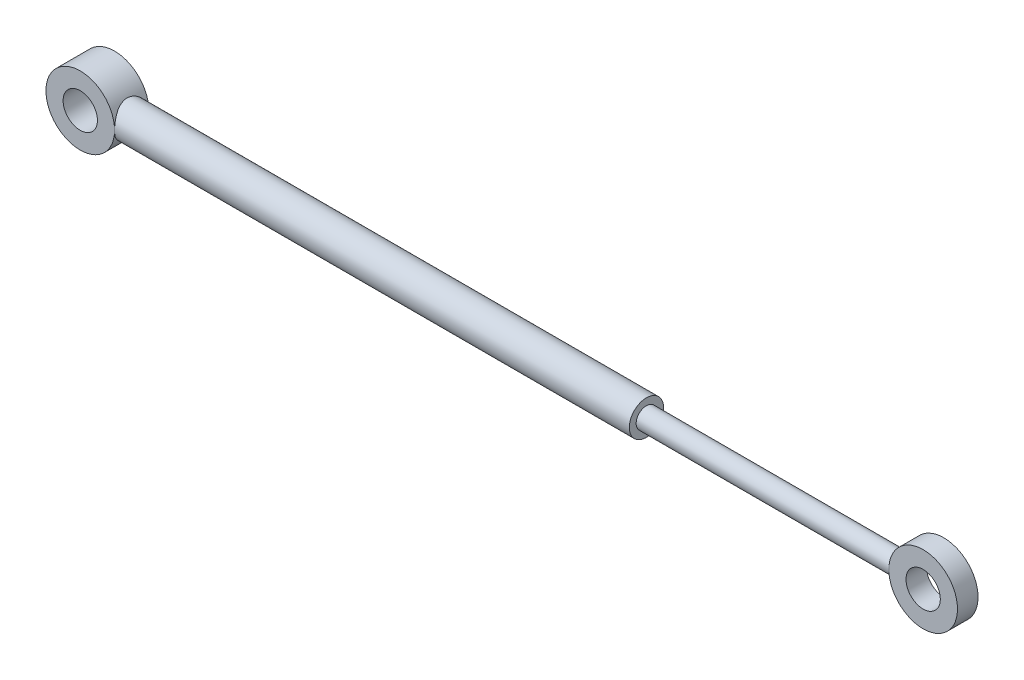
ISO-10303-21;
HEADER;
FILE_DESCRIPTION(('STEP AP214'),'2;1');
FILE_NAME('part.step','',(''),(''),'','','');
FILE_SCHEMA(('AUTOMOTIVE_DESIGN { 1 0 10303 214 1 1 1 1 }'));
ENDSEC;
DATA;
#1=APPLICATION_CONTEXT('core data for automotive mechanical design processes');
#2=APPLICATION_PROTOCOL_DEFINITION('international standard','automotive_design',2000,#1);
#3=PRODUCT_CONTEXT('',#1,'mechanical');
#4=PRODUCT('Part','Part','',(#3));
#5=PRODUCT_RELATED_PRODUCT_CATEGORY('part','',(#4));
#6=PRODUCT_DEFINITION_FORMATION('','',#4);
#7=PRODUCT_DEFINITION_CONTEXT('part definition',#1,'design');
#8=PRODUCT_DEFINITION('design','',#6,#7);
#9=PRODUCT_DEFINITION_SHAPE('','',#8);
#10=(LENGTH_UNIT() NAMED_UNIT(*) SI_UNIT(.MILLI.,.METRE.));
#11=(NAMED_UNIT(*) PLANE_ANGLE_UNIT() SI_UNIT($,.RADIAN.));
#12=(NAMED_UNIT(*) SI_UNIT($,.STERADIAN.) SOLID_ANGLE_UNIT());
#13=UNCERTAINTY_MEASURE_WITH_UNIT(LENGTH_MEASURE(1.E-05),#10,'distance_accuracy_value','');
#14=(GEOMETRIC_REPRESENTATION_CONTEXT(3) GLOBAL_UNCERTAINTY_ASSIGNED_CONTEXT((#13)) GLOBAL_UNIT_ASSIGNED_CONTEXT((#10,
#11,#12)) REPRESENTATION_CONTEXT('',''));
#15=CARTESIAN_POINT('',(0.,0.,0.));
#16=DIRECTION('',(0.,0.,1.));
#17=DIRECTION('',(1.,0.,0.));
#18=AXIS2_PLACEMENT_3D('',#15,#16,#17);
#19=CARTESIAN_POINT('',(160.,0.,5.));
#20=DIRECTION('',(1.,0.,0.));
#21=DIRECTION('',(0.,0.,-1.));
#22=AXIS2_PLACEMENT_3D('',#19,#20,#21);
#23=PLANE('',#22);
#24=CARTESIAN_POINT('',(160.,0.,5.));
#25=DIRECTION('',(1.,0.,0.));
#26=DIRECTION('',(0.,0.,-1.));
#27=AXIS2_PLACEMENT_3D('',#24,#25,#26);
#28=CIRCLE('',#27,5.);
#29=CARTESIAN_POINT('',(160.,0.,0.));
#30=VERTEX_POINT('',#29);
#31=EDGE_CURVE('E12',#30,#30,#28,.T.);
#32=ORIENTED_EDGE('',*,*,#31,.T.);
#33=EDGE_LOOP('',(#32));
#34=FACE_BOUND('',#33,.T.);
#35=CARTESIAN_POINT('',(160.,0.,5.));
#36=DIRECTION('',(1.,0.,0.));
#37=DIRECTION('',(0.,0.,-1.));
#38=AXIS2_PLACEMENT_3D('',#35,#36,#37);
#39=CIRCLE('',#38,3.);
#40=CARTESIAN_POINT('',(160.,0.,2.));
#41=VERTEX_POINT('',#40);
#42=EDGE_CURVE('E75',#41,#41,#39,.T.);
#43=ORIENTED_EDGE('',*,*,#42,.F.);
#44=EDGE_LOOP('',(#43));
#45=FACE_BOUND('',#44,.T.);
#46=ADVANCED_FACE('F64',(#34,#45),#23,.T.);
#47=CARTESIAN_POINT('',(5.,0.,5.));
#48=DIRECTION('',(1.,0.,0.));
#49=DIRECTION('',(0.,0.,-1.));
#50=AXIS2_PLACEMENT_3D('',#47,#48,#49);
#51=PLANE('',#50);
#52=CARTESIAN_POINT('',(5.,0.,5.));
#53=DIRECTION('',(1.,0.,0.));
#54=DIRECTION('',(0.,0.,-1.));
#55=AXIS2_PLACEMENT_3D('',#52,#53,#54);
#56=CIRCLE('',#55,5.);
#57=CARTESIAN_POINT('',(5.,0.,0.));
#58=VERTEX_POINT('',#57);
#59=EDGE_CURVE('E68',#58,#58,#56,.T.);
#60=ORIENTED_EDGE('',*,*,#59,.F.);
#61=EDGE_LOOP('',(#60));
#62=FACE_BOUND('',#61,.T.);
#63=CARTESIAN_POINT('',(5.,0.,5.));
#64=DIRECTION('',(1.,0.,0.));
#65=DIRECTION('',(0.,0.,-1.));
#66=AXIS2_PLACEMENT_3D('',#63,#64,#65);
#67=CIRCLE('',#66,3.);
#68=CARTESIAN_POINT('',(5.,0.,2.));
#69=VERTEX_POINT('',#68);
#70=EDGE_CURVE('E77',#69,#69,#67,.T.);
#71=ORIENTED_EDGE('',*,*,#70,.T.);
#72=EDGE_LOOP('',(#71));
#73=FACE_BOUND('',#72,.T.);
#74=ADVANCED_FACE('F87',(#62,#73),#51,.F.);
#75=CARTESIAN_POINT('',(160.,0.,5.));
#76=DIRECTION('',(-1.,0.,0.));
#77=DIRECTION('',(0.,0.,1.));
#78=AXIS2_PLACEMENT_3D('',#75,#76,#77);
#79=CYLINDRICAL_SURFACE('',#78,5.);
#80=ORIENTED_EDGE('',*,*,#31,.F.);
#81=EDGE_LOOP('',(#80));
#82=FACE_BOUND('',#81,.T.);
#83=ORIENTED_EDGE('',*,*,#59,.T.);
#84=EDGE_LOOP('',(#83));
#85=FACE_BOUND('',#84,.T.);
#86=ADVANCED_FACE('F66',(#82,#85),#79,.T.);
#87=CARTESIAN_POINT('',(160.,0.,5.));
#88=DIRECTION('',(-1.,0.,0.));
#89=DIRECTION('',(0.,0.,1.));
#90=AXIS2_PLACEMENT_3D('',#87,#88,#89);
#91=CYLINDRICAL_SURFACE('',#90,3.);
#92=ORIENTED_EDGE('',*,*,#42,.T.);
#93=EDGE_LOOP('',(#92));
#94=FACE_BOUND('',#93,.T.);
#95=ORIENTED_EDGE('',*,*,#70,.F.);
#96=EDGE_LOOP('',(#95));
#97=FACE_BOUND('',#96,.T.);
#98=ADVANCED_FACE('F83',(#94,#97),#91,.F.);
#99=CLOSED_SHELL('',(#46,#74,#86,#98));
#100=MANIFOLD_SOLID_BREP('B2',#99);
#101=CARTESIAN_POINT('',(243.643659115579,0.,10.));
#102=DIRECTION('',(0.,0.,-1.));
#103=DIRECTION('',(-1.,0.,0.));
#104=AXIS2_PLACEMENT_3D('',#101,#102,#103);
#105=CYLINDRICAL_SURFACE('',#104,4.99999999999999);
#106=CARTESIAN_POINT('',(243.643659115579,0.,8.));
#107=DIRECTION('',(0.,0.,1.));
#108=DIRECTION('',(1.,0.,0.));
#109=AXIS2_PLACEMENT_3D('',#106,#107,#108);
#110=CIRCLE('',#109,4.99999999999999);
#111=CARTESIAN_POINT('',(248.643659115579,0.,8.));
#112=VERTEX_POINT('',#111);
#113=EDGE_CURVE('E146',#112,#112,#110,.T.);
#114=ORIENTED_EDGE('',*,*,#113,.T.);
#115=EDGE_LOOP('',(#114));
#116=FACE_BOUND('',#115,.T.);
#117=CARTESIAN_POINT('',(243.643659115579,0.,2.));
#118=DIRECTION('',(0.,0.,-1.));
#119=DIRECTION('',(-1.,0.,0.));
#120=AXIS2_PLACEMENT_3D('',#117,#118,#119);
#121=CIRCLE('',#120,4.99999999999999);
#122=CARTESIAN_POINT('',(238.643659115579,0.,2.));
#123=VERTEX_POINT('',#122);
#124=EDGE_CURVE('E136',#123,#123,#121,.T.);
#125=ORIENTED_EDGE('',*,*,#124,.T.);
#126=EDGE_LOOP('',(#125));
#127=FACE_BOUND('',#126,.T.);
#128=ADVANCED_FACE('F132',(#116,#127),#105,.F.);
#129=CARTESIAN_POINT('',(233.231902052492,16.,8.));
#130=DIRECTION('',(0.,0.,1.));
#131=DIRECTION('',(1.,0.,0.));
#132=AXIS2_PLACEMENT_3D('',#129,#130,#131);
#133=PLANE('',#132);
#134=ORIENTED_EDGE('',*,*,#113,.F.);
#135=EDGE_LOOP('',(#134));
#136=FACE_BOUND('',#135,.T.);
#137=CARTESIAN_POINT('',(243.643659115579,0.,8.));
#138=DIRECTION('',(0.,0.,1.));
#139=DIRECTION('',(1.,0.,0.));
#140=AXIS2_PLACEMENT_3D('',#137,#138,#139);
#141=CIRCLE('',#140,9.99999999999999);
#142=CARTESIAN_POINT('',(253.643659115579,0.,8.));
#143=VERTEX_POINT('',#142);
#144=EDGE_CURVE('E144',#143,#143,#141,.T.);
#145=ORIENTED_EDGE('',*,*,#144,.T.);
#146=EDGE_LOOP('',(#145));
#147=FACE_BOUND('',#146,.T.);
#148=ADVANCED_FACE('F153',(#136,#147),#133,.T.);
#149=CARTESIAN_POINT('',(233.231902052492,16.,2.));
#150=DIRECTION('',(0.,0.,-1.));
#151=DIRECTION('',(-1.,0.,0.));
#152=AXIS2_PLACEMENT_3D('',#149,#150,#151);
#153=PLANE('',#152);
#154=ORIENTED_EDGE('',*,*,#124,.F.);
#155=EDGE_LOOP('',(#154));
#156=FACE_BOUND('',#155,.T.);
#157=CARTESIAN_POINT('',(243.643659115579,0.,2.));
#158=DIRECTION('',(0.,0.,-1.));
#159=DIRECTION('',(-1.,0.,0.));
#160=AXIS2_PLACEMENT_3D('',#157,#158,#159);
#161=CIRCLE('',#160,9.99999999999999);
#162=CARTESIAN_POINT('',(233.643659115579,0.,2.));
#163=VERTEX_POINT('',#162);
#164=EDGE_CURVE('E63',#163,#163,#161,.T.);
#165=ORIENTED_EDGE('',*,*,#164,.T.);
#166=EDGE_LOOP('',(#165));
#167=FACE_BOUND('',#166,.T.);
#168=ADVANCED_FACE('F157',(#156,#167),#153,.T.);
#169=CARTESIAN_POINT('',(243.643659115579,0.,10.));
#170=DIRECTION('',(0.,0.,-1.));
#171=DIRECTION('',(-1.,0.,0.));
#172=AXIS2_PLACEMENT_3D('',#169,#170,#171);
#173=CYLINDRICAL_SURFACE('',#172,9.99999999999999);
#174=ORIENTED_EDGE('',*,*,#144,.F.);
#175=EDGE_LOOP('',(#174));
#176=FACE_BOUND('',#175,.T.);
#177=ORIENTED_EDGE('',*,*,#164,.F.);
#178=EDGE_LOOP('',(#177));
#179=FACE_BOUND('',#178,.T.);
#180=ADVANCED_FACE('F134',(#176,#179),#173,.T.);
#181=CLOSED_SHELL('',(#128,#148,#168,#180));
#182=MANIFOLD_SOLID_BREP('B7',#181);
#183=CARTESIAN_POINT('',(0.,0.,10.));
#184=DIRECTION('',(0.,0.,-1.));
#185=DIRECTION('',(-1.,0.,0.));
#186=AXIS2_PLACEMENT_3D('',#183,#184,#185);
#187=CYLINDRICAL_SURFACE('',#186,10.);
#188=CARTESIAN_POINT('',(0.,0.,10.));
#189=DIRECTION('',(0.,0.,1.));
#190=DIRECTION('',(1.,0.,0.));
#191=AXIS2_PLACEMENT_3D('',#188,#189,#190);
#192=CIRCLE('',#191,10.);
#193=CARTESIAN_POINT('',(10.,0.,10.));
#194=VERTEX_POINT('',#193);
#195=EDGE_CURVE('E204',#194,#194,#192,.T.);
#196=ORIENTED_EDGE('',*,*,#195,.F.);
#197=EDGE_LOOP('',(#196));
#198=FACE_BOUND('',#197,.T.);
#199=CARTESIAN_POINT('',(0.,0.,0.));
#200=DIRECTION('',(0.,0.,1.));
#201=DIRECTION('',(1.,0.,0.));
#202=AXIS2_PLACEMENT_3D('',#199,#200,#201);
#203=CIRCLE('',#202,10.);
#204=CARTESIAN_POINT('',(10.,0.,0.));
#205=VERTEX_POINT('',#204);
#206=EDGE_CURVE('E208',#205,#205,#203,.T.);
#207=ORIENTED_EDGE('',*,*,#206,.T.);
#208=EDGE_LOOP('',(#207));
#209=FACE_BOUND('',#208,.T.);
#210=CARTESIAN_POINT('',(10.,0.,8.));
#211=CARTESIAN_POINT('',(9.99999858501101,-0.164577225506599,7.99999800503023));
#212=CARTESIAN_POINT('',(9.99589831387907,-0.329174636703057,7.98641227275207));
#213=CARTESIAN_POINT('',(9.97994211187382,-0.653576250609759,7.9325572915558));
#214=CARTESIAN_POINT('',(9.96808386779384,-0.813379008822837,7.89228008395332));
#215=CARTESIAN_POINT('',(9.93791105003673,-1.12346541550905,7.78650796617947));
#216=CARTESIAN_POINT('',(9.91960600500851,-1.27376272879074,7.72105026076213));
#217=CARTESIAN_POINT('',(9.87844218475291,-1.56124836210626,7.56692781388833));
#218=CARTESIAN_POINT('',(9.85558280384133,-1.69843493493933,7.47825998520917));
#219=CARTESIAN_POINT('',(9.80701474385548,-1.95974359436748,7.27755198505467));
#220=CARTESIAN_POINT('',(9.78124767314073,-2.08343614248868,7.16496674822818));
#221=CARTESIAN_POINT('',(9.73011668420885,-2.31049841846647,6.92078154017964));
#222=CARTESIAN_POINT('',(9.70475283449003,-2.41386472654881,6.78917837575009));
#223=CARTESIAN_POINT('',(9.65668227987544,-2.59960075447415,6.50705849392479));
#224=CARTESIAN_POINT('',(9.6340481332775,-2.68144618044427,6.35618307801853));
#225=CARTESIAN_POINT('',(9.59487240788062,-2.8184278954952,6.04202149153942));
#226=CARTESIAN_POINT('',(9.57832936626622,-2.87357059839946,5.87873831214406));
#227=CARTESIAN_POINT('',(9.55381741676869,-2.95403267365303,5.54921946773909));
#228=CARTESIAN_POINT('',(9.54562138649067,-2.98014392469355,5.38319451227212));
#229=CARTESIAN_POINT('',(9.53805579499535,-3.00427461229344,5.04893368756648));
#230=CARTESIAN_POINT('',(9.53868409521143,-3.00230085522157,4.88069836388183));
#231=CARTESIAN_POINT('',(9.54849488135556,-2.97093954399623,4.55323218278304));
#232=CARTESIAN_POINT('',(9.55736777198281,-2.94254410525371,4.39389549927553));
#233=CARTESIAN_POINT('',(9.58216712457249,-2.86074840854112,4.08236042745308));
#234=CARTESIAN_POINT('',(9.59809428264701,-2.80734568283282,3.93016274525133));
#235=CARTESIAN_POINT('',(9.63545466149946,-2.67632053307363,3.63479930067852));
#236=CARTESIAN_POINT('',(9.65696032231904,-2.59837633869285,3.49178583208947));
#237=CARTESIAN_POINT('',(9.70301974000129,-2.42070445177366,3.22053595597961));
#238=CARTESIAN_POINT('',(9.72757423493982,-2.32097148005176,3.09230314117244));
#239=CARTESIAN_POINT('',(9.77822022595875,-2.09762581531092,2.84862761847595));
#240=CARTESIAN_POINT('',(9.80433308620996,-1.97318981493394,2.73394267194065));
#241=CARTESIAN_POINT('',(9.85424488126517,-1.70652651862793,2.5268920318715));
#242=CARTESIAN_POINT('',(9.87804367036821,-1.56429810372177,2.43452774317114));
#243=CARTESIAN_POINT('',(9.92086320138941,-1.2647100766856,2.27428015507054));
#244=CARTESIAN_POINT('',(9.93985087336628,-1.10725549949589,2.20656496750027));
#245=CARTESIAN_POINT('',(9.97067043664444,-0.782490831207033,2.09880081980074));
#246=CARTESIAN_POINT('',(9.98250432373999,-0.615183503179158,2.05874414293502));
#247=CARTESIAN_POINT('',(9.99736729287077,-0.281904485336659,2.00869564420121));
#248=CARTESIAN_POINT('',(10.0006970083558,-0.11610019520237,1.99767682839678));
#249=CARTESIAN_POINT('',(9.9990584648352,0.214999211646768,2.00313831142416));
#250=CARTESIAN_POINT('',(9.99409131355514,0.380294393381563,2.01961493930288));
#251=CARTESIAN_POINT('',(9.97661393974325,0.701807210619393,2.07876922222299));
#252=CARTESIAN_POINT('',(9.96427659598829,0.858145545228337,2.12084677516174));
#253=CARTESIAN_POINT('',(9.9334869568307,1.16150927790904,2.2292864655564));
#254=CARTESIAN_POINT('',(9.91503392642188,1.30853355405116,2.29565152207572));
#255=CARTESIAN_POINT('',(9.87339308702631,1.5928743789221,2.45250633096226));
#256=CARTESIAN_POINT('',(9.8501056165928,1.72988765239933,2.54351868189595));
#257=CARTESIAN_POINT('',(9.80146937528705,1.98704661596029,2.7464495081056));
#258=CARTESIAN_POINT('',(9.7761200886242,2.10718806471188,2.85837322377529));
#259=CARTESIAN_POINT('',(9.72506343738007,2.33171489102052,3.10477461673873));
#260=CARTESIAN_POINT('',(9.69937650065514,2.43536962463001,3.23992375154364));
#261=CARTESIAN_POINT('',(9.65153030477949,2.61857990144312,3.52625587802688));
#262=CARTESIAN_POINT('',(9.62937095313121,2.69813607658964,3.67743844911575));
#263=CARTESIAN_POINT('',(9.5913437922631,2.83034694254315,3.99106498251003));
#264=CARTESIAN_POINT('',(9.57544675673501,2.88312693874021,4.15345237307566));
#265=CARTESIAN_POINT('',(9.55183188739737,2.96043461630306,4.48537593786046));
#266=CARTESIAN_POINT('',(9.54411125069387,2.98497197957849,4.65490964156606));
#267=CARTESIAN_POINT('',(9.53799944941558,3.0044396896993,4.98872303677684));
#268=CARTESIAN_POINT('',(9.53923294700395,3.00056110615887,5.15292730209884));
#269=CARTESIAN_POINT('',(9.54998802392189,2.9661501088861,5.47822820680123));
#270=CARTESIAN_POINT('',(9.55950927135902,2.93561876249408,5.63932497036102));
#271=CARTESIAN_POINT('',(9.58551527389243,2.84953777608686,5.95189079826334));
#272=CARTESIAN_POINT('',(9.60191209104934,2.79430351014248,6.10345457471739));
#273=CARTESIAN_POINT('',(9.63980557805265,2.66063014242147,6.39528487764145));
#274=CARTESIAN_POINT('',(9.6613032238508,2.58218659925722,6.53554923528315));
#275=CARTESIAN_POINT('',(9.70795352855338,2.40097527610175,6.80632623305253));
#276=CARTESIAN_POINT('',(9.7332108032858,2.29742552185996,6.93629752252037));
#277=CARTESIAN_POINT('',(9.78402640899067,2.07034869259555,7.17740499661618));
#278=CARTESIAN_POINT('',(9.80958481647543,1.94681643426898,7.28853627893564));
#279=CARTESIAN_POINT('',(9.85901873141573,1.67893152436651,7.49204682458994));
#280=CARTESIAN_POINT('',(9.88282319531422,1.53407577158122,7.58378289371095));
#281=CARTESIAN_POINT('',(9.92521360911553,1.23028274796705,7.74147033980809));
#282=CARTESIAN_POINT('',(9.94380199862114,1.0713521059979,7.80743377654903));
#283=CARTESIAN_POINT('',(9.97204349938619,0.761515425310559,7.90579055130549));
#284=CARTESIAN_POINT('',(9.9824405476214,0.611573923908465,7.9410233457665));
#285=CARTESIAN_POINT('',(9.9964188898898,0.307760390461556,7.98812705048316));
#286=CARTESIAN_POINT('',(10.0000013230948,0.153889019716278,8.00000186540964));
#287=CARTESIAN_POINT('',(10.,0.,8.));
#288=B_SPLINE_CURVE_WITH_KNOTS('',3,(#210,#211,#212,#213,#214,#215,#216,#217,#218,#219,#220,
#221,#222,#223,#224,#225,#226,#227,#228,#229,#230,#231,#232,#233,#234,#235,#236,#237,#238,#239,
#240,#241,#242,#243,#244,#245,#246,#247,#248,#249,#250,#251,#252,#253,#254,#255,#256,#257,#258,
#259,#260,#261,#262,#263,#264,#265,#266,#267,#268,#269,#270,#271,#272,#273,#274,#275,#276,#277,
#278,#279,#280,#281,#282,#283,#284,#285,#286,#287),.UNSPECIFIED.,.T.,.F.,(4,2,2,2,2,2,2,2,2,2,2,
2,2,2,2,2,2,2,2,2,2,2,2,2,2,2,2,2,2,2,2,2,2,2,2,2,2,2,4),(0.,0.493166407225219,
0.986479929691995,1.47906735260174,1.9717203288254,2.47711205896382,2.98258874577265,
3.49942962008217,4.01614629086446,4.51839378713197,5.02051956638178,5.50452033395352,
5.98856887316002,6.47924852894239,6.97004720317111,7.48134208096334,7.99266913062144,
8.50742093763378,9.02202907057616,9.5181761887709,10.0142570710065,10.4991349336465,
10.9840710918746,11.4802261140582,11.9765056400038,12.4908080064564,13.0050968850536,
13.516956299025,14.0286401892056,14.5190031093854,15.0093463933232,15.4936008081456,
15.9779479511534,16.4799385136898,16.9820594980413,17.4988599232246,18.0154182319959,
18.4766338387004,18.9377723390687),.UNSPECIFIED.);
#289=CARTESIAN_POINT('',(10.,0.,8.));
#290=VERTEX_POINT('',#289);
#291=EDGE_CURVE('E131',#290,#290,#288,.T.);
#292=ORIENTED_EDGE('',*,*,#291,.F.);
#293=EDGE_LOOP('',(#292));
#294=FACE_BOUND('',#293,.T.);
#295=ADVANCED_FACE('F193',(#198,#209,#294),#187,.T.);
#296=CARTESIAN_POINT('',(0.,0.,10.));
#297=DIRECTION('',(0.,0.,1.));
#298=DIRECTION('',(1.,0.,0.));
#299=AXIS2_PLACEMENT_3D('',#296,#297,#298);
#300=PLANE('',#299);
#301=ORIENTED_EDGE('',*,*,#195,.T.);
#302=EDGE_LOOP('',(#301));
#303=FACE_BOUND('',#302,.T.);
#304=CARTESIAN_POINT('',(0.,0.,10.));
#305=DIRECTION('',(0.,0.,1.));
#306=DIRECTION('',(1.,0.,0.));
#307=AXIS2_PLACEMENT_3D('',#304,#305,#306);
#308=CIRCLE('',#307,5.);
#309=CARTESIAN_POINT('',(5.,0.,10.));
#310=VERTEX_POINT('',#309);
#311=EDGE_CURVE('E213',#310,#310,#308,.T.);
#312=ORIENTED_EDGE('',*,*,#311,.F.);
#313=EDGE_LOOP('',(#312));
#314=FACE_BOUND('',#313,.T.);
#315=ADVANCED_FACE('F241',(#303,#314),#300,.T.);
#316=CARTESIAN_POINT('',(0.,0.,0.));
#317=DIRECTION('',(0.,0.,1.));
#318=DIRECTION('',(1.,0.,0.));
#319=AXIS2_PLACEMENT_3D('',#316,#317,#318);
#320=PLANE('',#319);
#321=ORIENTED_EDGE('',*,*,#206,.F.);
#322=EDGE_LOOP('',(#321));
#323=FACE_BOUND('',#322,.T.);
#324=CARTESIAN_POINT('',(0.,0.,0.));
#325=DIRECTION('',(0.,0.,1.));
#326=DIRECTION('',(1.,0.,0.));
#327=AXIS2_PLACEMENT_3D('',#324,#325,#326);
#328=CIRCLE('',#327,5.);
#329=CARTESIAN_POINT('',(5.,0.,0.));
#330=VERTEX_POINT('',#329);
#331=EDGE_CURVE('E215',#330,#330,#328,.T.);
#332=ORIENTED_EDGE('',*,*,#331,.T.);
#333=EDGE_LOOP('',(#332));
#334=FACE_BOUND('',#333,.T.);
#335=ADVANCED_FACE('F236',(#323,#334),#320,.F.);
#336=CARTESIAN_POINT('',(0.,0.,10.));
#337=DIRECTION('',(0.,0.,-1.));
#338=DIRECTION('',(-1.,0.,0.));
#339=AXIS2_PLACEMENT_3D('',#336,#337,#338);
#340=CYLINDRICAL_SURFACE('',#339,5.);
#341=ORIENTED_EDGE('',*,*,#311,.T.);
#342=EDGE_LOOP('',(#341));
#343=FACE_BOUND('',#342,.T.);
#344=ORIENTED_EDGE('',*,*,#331,.F.);
#345=EDGE_LOOP('',(#344));
#346=FACE_BOUND('',#345,.T.);
#347=ADVANCED_FACE('F228',(#343,#346),#340,.F.);
#348=CARTESIAN_POINT('',(237.,0.,5.));
#349=DIRECTION('',(-1.,0.,0.));
#350=DIRECTION('',(0.,0.,1.));
#351=AXIS2_PLACEMENT_3D('',#348,#349,#350);
#352=CYLINDRICAL_SURFACE('',#351,3.);
#353=CARTESIAN_POINT('',(237.,0.,5.));
#354=DIRECTION('',(1.,0.,0.));
#355=DIRECTION('',(0.,0.,-1.));
#356=AXIS2_PLACEMENT_3D('',#353,#354,#355);
#357=CIRCLE('',#356,3.);
#358=CARTESIAN_POINT('',(237.,0.,2.));
#359=VERTEX_POINT('',#358);
#360=EDGE_CURVE('E218',#359,#359,#357,.T.);
#361=ORIENTED_EDGE('',*,*,#360,.F.);
#362=EDGE_LOOP('',(#361));
#363=FACE_BOUND('',#362,.T.);
#364=ORIENTED_EDGE('',*,*,#291,.T.);
#365=EDGE_LOOP('',(#364));
#366=FACE_BOUND('',#365,.T.);
#367=ADVANCED_FACE('F226',(#363,#366),#352,.T.);
#368=CARTESIAN_POINT('',(237.,0.,5.));
#369=DIRECTION('',(1.,0.,0.));
#370=DIRECTION('',(0.,0.,-1.));
#371=AXIS2_PLACEMENT_3D('',#368,#369,#370);
#372=PLANE('',#371);
#373=ORIENTED_EDGE('',*,*,#360,.T.);
#374=EDGE_LOOP('',(#373));
#375=FACE_BOUND('',#374,.T.);
#376=ADVANCED_FACE('F224',(#375),#372,.T.);
#377=CLOSED_SHELL('',(#295,#315,#335,#347,#367,#376));
#378=MANIFOLD_SOLID_BREP('B58',#377);
#379=ADVANCED_BREP_SHAPE_REPRESENTATION('',(#18,#100,#182,#378),#14);
#380=SHAPE_DEFINITION_REPRESENTATION(#9,#379);
ENDSEC;
END-ISO-10303-21;
